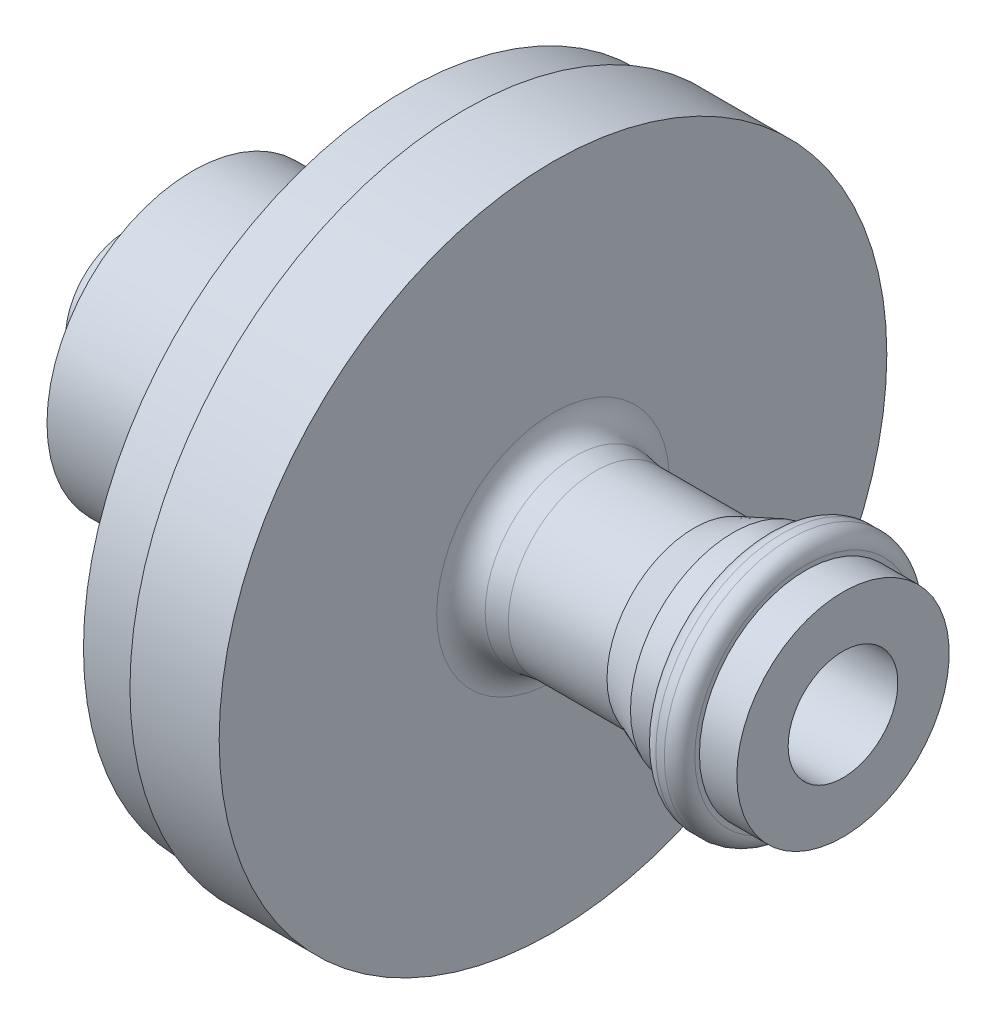
ISO-10303-21;
HEADER;
FILE_DESCRIPTION(('STEP AP214'),'2;1');
FILE_NAME('part.step','',(''),(''),'','','');
FILE_SCHEMA(('AUTOMOTIVE_DESIGN { 1 0 10303 214 1 1 1 1 }'));
ENDSEC;
DATA;
#1=APPLICATION_CONTEXT('core data for automotive mechanical design processes');
#2=APPLICATION_PROTOCOL_DEFINITION('international standard','automotive_design',2000,#1);
#3=PRODUCT_CONTEXT('',#1,'mechanical');
#4=PRODUCT('Part','Part','',(#3));
#5=PRODUCT_RELATED_PRODUCT_CATEGORY('part','',(#4));
#6=PRODUCT_DEFINITION_FORMATION('','',#4);
#7=PRODUCT_DEFINITION_CONTEXT('part definition',#1,'design');
#8=PRODUCT_DEFINITION('design','',#6,#7);
#9=PRODUCT_DEFINITION_SHAPE('','',#8);
#10=(LENGTH_UNIT() NAMED_UNIT(*) SI_UNIT(.MILLI.,.METRE.));
#11=(NAMED_UNIT(*) PLANE_ANGLE_UNIT() SI_UNIT($,.RADIAN.));
#12=(NAMED_UNIT(*) SI_UNIT($,.STERADIAN.) SOLID_ANGLE_UNIT());
#13=UNCERTAINTY_MEASURE_WITH_UNIT(LENGTH_MEASURE(1.E-05),#10,'distance_accuracy_value','');
#14=(GEOMETRIC_REPRESENTATION_CONTEXT(3) GLOBAL_UNCERTAINTY_ASSIGNED_CONTEXT((#13)) GLOBAL_UNIT_ASSIGNED_CONTEXT((#10,
#11,#12)) REPRESENTATION_CONTEXT('',''));
#15=CARTESIAN_POINT('',(0.,0.,0.));
#16=DIRECTION('',(0.,0.,1.));
#17=DIRECTION('',(1.,0.,0.));
#18=AXIS2_PLACEMENT_3D('',#15,#16,#17);
#19=CARTESIAN_POINT('',(10.4137338380613,0.,0.));
#20=DIRECTION('',(1.,0.,0.));
#21=DIRECTION('',(0.,0.,-1.));
#22=AXIS2_PLACEMENT_3D('',#19,#20,#21);
#23=PLANE('',#22);
#24=CARTESIAN_POINT('',(10.4137338380613,0.,0.));
#25=DIRECTION('',(-1.,0.,0.));
#26=DIRECTION('',(0.,0.,1.));
#27=AXIS2_PLACEMENT_3D('',#24,#25,#26);
#28=CIRCLE('',#27,3.47404107604442);
#29=CARTESIAN_POINT('',(10.4137338380613,0.,3.47404107604442));
#30=VERTEX_POINT('',#29);
#31=EDGE_CURVE('E136',#30,#30,#28,.T.);
#32=ORIENTED_EDGE('',*,*,#31,.T.);
#33=EDGE_LOOP('',(#32));
#34=FACE_BOUND('',#33,.T.);
#35=CARTESIAN_POINT('',(10.4137338380613,0.,0.));
#36=DIRECTION('',(-1.,0.,0.));
#37=DIRECTION('',(0.,0.,1.));
#38=AXIS2_PLACEMENT_3D('',#35,#36,#37);
#39=CIRCLE('',#38,3.62448356072604);
#40=CARTESIAN_POINT('',(10.4137338380613,0.,3.62448356072604));
#41=VERTEX_POINT('',#40);
#42=EDGE_CURVE('E10',#41,#41,#39,.T.);
#43=ORIENTED_EDGE('',*,*,#42,.F.);
#44=EDGE_LOOP('',(#43));
#45=FACE_BOUND('',#44,.T.);
#46=ADVANCED_FACE('F33',(#34,#45),#23,.T.);
#47=CARTESIAN_POINT('',(9.91373383806128,0.,0.));
#48=DIRECTION('',(-1.,0.,0.));
#49=DIRECTION('',(0.,0.,1.));
#50=AXIS2_PLACEMENT_3D('',#47,#48,#49);
#51=TOROIDAL_SURFACE('',#50,3.62448356072604,0.5);
#52=CARTESIAN_POINT('',(9.91373383806127,0.,0.));
#53=DIRECTION('',(-1.,0.,0.));
#54=DIRECTION('',(0.,0.,1.));
#55=AXIS2_PLACEMENT_3D('',#52,#53,#54);
#56=CIRCLE('',#55,4.12448356072604);
#57=CARTESIAN_POINT('',(9.91373383806127,0.,4.12448356072604));
#58=VERTEX_POINT('',#57);
#59=EDGE_CURVE('E39',#58,#58,#56,.T.);
#60=ORIENTED_EDGE('',*,*,#59,.F.);
#61=EDGE_LOOP('',(#60));
#62=FACE_BOUND('',#61,.T.);
#63=ORIENTED_EDGE('',*,*,#42,.T.);
#64=EDGE_LOOP('',(#63));
#65=FACE_BOUND('',#64,.T.);
#66=ADVANCED_FACE('F154',(#62,#65),#51,.T.);
#67=CARTESIAN_POINT('',(-11.7644248083742,0.,0.));
#68=DIRECTION('',(-1.,0.,0.));
#69=DIRECTION('',(0.,0.,1.));
#70=AXIS2_PLACEMENT_3D('',#67,#68,#69);
#71=CYLINDRICAL_SURFACE('',#70,4.12448356072604);
#72=CARTESIAN_POINT('',(9.63650464613597,0.,0.));
#73=DIRECTION('',(-1.,0.,0.));
#74=DIRECTION('',(0.,0.,1.));
#75=AXIS2_PLACEMENT_3D('',#72,#73,#74);
#76=CIRCLE('',#75,4.12448356072604);
#77=CARTESIAN_POINT('',(9.63650464613597,0.,4.12448356072604));
#78=VERTEX_POINT('',#77);
#79=EDGE_CURVE('E43',#78,#78,#76,.T.);
#80=ORIENTED_EDGE('',*,*,#79,.F.);
#81=EDGE_LOOP('',(#80));
#82=FACE_BOUND('',#81,.T.);
#83=ORIENTED_EDGE('',*,*,#59,.T.);
#84=EDGE_LOOP('',(#83));
#85=FACE_BOUND('',#84,.T.);
#86=ADVANCED_FACE('F158',(#82,#85),#71,.T.);
#87=CARTESIAN_POINT('',(9.63650464613596,0.,0.));
#88=DIRECTION('',(-1.,0.,0.));
#89=DIRECTION('',(0.,0.,1.));
#90=AXIS2_PLACEMENT_3D('',#87,#88,#89);
#91=TOROIDAL_SURFACE('',#90,3.62448356072604,0.5);
#92=CARTESIAN_POINT('',(9.13650464613596,0.,0.));
#93=DIRECTION('',(-1.,0.,0.));
#94=DIRECTION('',(0.,0.,1.));
#95=AXIS2_PLACEMENT_3D('',#92,#93,#94);
#96=CIRCLE('',#95,3.62448356072604);
#97=CARTESIAN_POINT('',(9.13650464613596,0.,3.62448356072604));
#98=VERTEX_POINT('',#97);
#99=EDGE_CURVE('E47',#98,#98,#96,.T.);
#100=ORIENTED_EDGE('',*,*,#99,.F.);
#101=EDGE_LOOP('',(#100));
#102=FACE_BOUND('',#101,.T.);
#103=ORIENTED_EDGE('',*,*,#79,.T.);
#104=EDGE_LOOP('',(#103));
#105=FACE_BOUND('',#104,.T.);
#106=ADVANCED_FACE('F163',(#102,#105),#91,.T.);
#107=CARTESIAN_POINT('',(9.13650464613596,0.,0.));
#108=DIRECTION('',(-1.,0.,0.));
#109=DIRECTION('',(0.,0.,1.));
#110=AXIS2_PLACEMENT_3D('',#107,#108,#109);
#111=PLANE('',#110);
#112=ORIENTED_EDGE('',*,*,#99,.T.);
#113=EDGE_LOOP('',(#112));
#114=FACE_BOUND('',#113,.T.);
#115=CARTESIAN_POINT('',(9.13650464613596,0.,0.));
#116=DIRECTION('',(-1.,0.,0.));
#117=DIRECTION('',(0.,0.,1.));
#118=AXIS2_PLACEMENT_3D('',#115,#116,#117);
#119=CIRCLE('',#118,3.35678689662546);
#120=CARTESIAN_POINT('',(9.13650464613596,0.,3.35678689662546));
#121=VERTEX_POINT('',#120);
#122=EDGE_CURVE('E52',#121,#121,#119,.T.);
#123=ORIENTED_EDGE('',*,*,#122,.F.);
#124=EDGE_LOOP('',(#123));
#125=FACE_BOUND('',#124,.T.);
#126=ADVANCED_FACE('F169',(#114,#125),#111,.T.);
#127=CARTESIAN_POINT('',(-11.7644248083742,0.,0.));
#128=DIRECTION('',(-1.,0.,0.));
#129=DIRECTION('',(0.,0.,1.));
#130=AXIS2_PLACEMENT_3D('',#127,#128,#129);
#131=CYLINDRICAL_SURFACE('',#130,3.3567868966255);
#132=ORIENTED_EDGE('',*,*,#122,.T.);
#133=EDGE_LOOP('',(#132));
#134=FACE_BOUND('',#133,.T.);
#135=CARTESIAN_POINT('',(8.04102596729724,0.,0.));
#136=DIRECTION('',(-1.,0.,0.));
#137=DIRECTION('',(0.,0.,1.));
#138=AXIS2_PLACEMENT_3D('',#135,#136,#137);
#139=CIRCLE('',#138,3.35678689662553);
#140=CARTESIAN_POINT('',(8.04102596729724,0.,3.35678689662553));
#141=VERTEX_POINT('',#140);
#142=EDGE_CURVE('E55',#141,#141,#139,.T.);
#143=ORIENTED_EDGE('',*,*,#142,.F.);
#144=EDGE_LOOP('',(#143));
#145=FACE_BOUND('',#144,.T.);
#146=ADVANCED_FACE('F173',(#134,#145),#131,.T.);
#147=CARTESIAN_POINT('',(8.04102596729724,0.,0.));
#148=DIRECTION('',(1.,0.,0.));
#149=DIRECTION('',(0.,0.,-1.));
#150=AXIS2_PLACEMENT_3D('',#147,#148,#149);
#151=CONICAL_SURFACE('',#150,3.35678689662553,0.380506377112419);
#152=CARTESIAN_POINT('',(6.76153152712963,0.,0.));
#153=DIRECTION('',(-1.,0.,0.));
#154=DIRECTION('',(0.,0.,1.));
#155=AXIS2_PLACEMENT_3D('',#152,#153,#154);
#156=CIRCLE('',#155,2.84498912055841);
#157=CARTESIAN_POINT('',(6.76153152712963,0.,2.84498912055841));
#158=VERTEX_POINT('',#157);
#159=EDGE_CURVE('E58',#158,#158,#156,.T.);
#160=ORIENTED_EDGE('',*,*,#159,.F.);
#161=EDGE_LOOP('',(#160));
#162=FACE_BOUND('',#161,.T.);
#163=ORIENTED_EDGE('',*,*,#142,.T.);
#164=EDGE_LOOP('',(#163));
#165=FACE_BOUND('',#164,.T.);
#166=ADVANCED_FACE('F177',(#162,#165),#151,.T.);
#167=CARTESIAN_POINT('',(-11.7644248083742,0.,0.));
#168=DIRECTION('',(-1.,0.,0.));
#169=DIRECTION('',(0.,0.,1.));
#170=AXIS2_PLACEMENT_3D('',#167,#168,#169);
#171=CYLINDRICAL_SURFACE('',#170,2.84498912055841);
#172=CARTESIAN_POINT('',(3.53326863193747,0.,0.));
#173=DIRECTION('',(-1.,0.,0.));
#174=DIRECTION('',(0.,0.,1.));
#175=AXIS2_PLACEMENT_3D('',#172,#173,#174);
#176=CIRCLE('',#175,2.84498912055841);
#177=CARTESIAN_POINT('',(3.53326863193747,0.,2.84498912055841));
#178=VERTEX_POINT('',#177);
#179=EDGE_CURVE('E61',#178,#178,#176,.T.);
#180=ORIENTED_EDGE('',*,*,#179,.F.);
#181=EDGE_LOOP('',(#180));
#182=FACE_BOUND('',#181,.T.);
#183=ORIENTED_EDGE('',*,*,#159,.T.);
#184=EDGE_LOOP('',(#183));
#185=FACE_BOUND('',#184,.T.);
#186=ADVANCED_FACE('F181',(#182,#185),#171,.T.);
#187=CARTESIAN_POINT('',(3.53326863193747,0.,0.));
#188=DIRECTION('',(-1.,0.,0.));
#189=DIRECTION('',(0.,0.,1.));
#190=AXIS2_PLACEMENT_3D('',#187,#188,#189);
#191=CONICAL_SURFACE('',#190,2.84498912055841,0.157318630881683);
#192=CARTESIAN_POINT('',(2.88095903547333,0.,0.));
#193=DIRECTION('',(-1.,0.,0.));
#194=DIRECTION('',(0.,0.,1.));
#195=AXIS2_PLACEMENT_3D('',#192,#193,#194);
#196=CIRCLE('',#195,2.94846462865671);
#197=CARTESIAN_POINT('',(2.88095903547333,0.,2.94846462865671));
#198=VERTEX_POINT('',#197);
#199=EDGE_CURVE('E64',#198,#198,#196,.T.);
#200=ORIENTED_EDGE('',*,*,#199,.F.);
#201=EDGE_LOOP('',(#200));
#202=FACE_BOUND('',#201,.T.);
#203=ORIENTED_EDGE('',*,*,#179,.T.);
#204=EDGE_LOOP('',(#203));
#205=FACE_BOUND('',#204,.T.);
#206=ADVANCED_FACE('F185',(#202,#205),#191,.T.);
#207=CARTESIAN_POINT('',(3.01675380098561,0.,0.));
#208=DIRECTION('',(-1.,0.,0.));
#209=DIRECTION('',(0.,0.,1.));
#210=AXIS2_PLACEMENT_3D('',#207,#208,#209);
#211=TOROIDAL_SURFACE('',#210,3.80451482180105,0.866753800985605);
#212=ORIENTED_EDGE('',*,*,#199,.T.);
#213=EDGE_LOOP('',(#212));
#214=FACE_BOUND('',#213,.T.);
#215=CARTESIAN_POINT('',(2.15,0.,0.));
#216=DIRECTION('',(-1.,0.,0.));
#217=DIRECTION('',(0.,0.,1.));
#218=AXIS2_PLACEMENT_3D('',#215,#216,#217);
#219=CIRCLE('',#218,3.80451482180105);
#220=CARTESIAN_POINT('',(2.15,0.,3.80451482180105));
#221=VERTEX_POINT('',#220);
#222=EDGE_CURVE('E67',#221,#221,#219,.T.);
#223=ORIENTED_EDGE('',*,*,#222,.F.);
#224=EDGE_LOOP('',(#223));
#225=FACE_BOUND('',#224,.T.);
#226=ADVANCED_FACE('F189',(#214,#225),#211,.F.);
#227=CARTESIAN_POINT('',(2.15,0.,0.));
#228=DIRECTION('',(1.,0.,0.));
#229=DIRECTION('',(0.,0.,-1.));
#230=AXIS2_PLACEMENT_3D('',#227,#228,#229);
#231=PLANE('',#230);
#232=ORIENTED_EDGE('',*,*,#222,.T.);
#233=EDGE_LOOP('',(#232));
#234=FACE_BOUND('',#233,.T.);
#235=CARTESIAN_POINT('',(2.15,0.,0.));
#236=DIRECTION('',(-1.,0.,0.));
#237=DIRECTION('',(0.,0.,1.));
#238=AXIS2_PLACEMENT_3D('',#235,#236,#237);
#239=CIRCLE('',#238,10.9195203977516);
#240=CARTESIAN_POINT('',(2.15,0.,10.9195203977516));
#241=VERTEX_POINT('',#240);
#242=EDGE_CURVE('E70',#241,#241,#239,.T.);
#243=ORIENTED_EDGE('',*,*,#242,.F.);
#244=EDGE_LOOP('',(#243));
#245=FACE_BOUND('',#244,.T.);
#246=ADVANCED_FACE('F193',(#234,#245),#231,.T.);
#247=CARTESIAN_POINT('',(-11.7644248083742,0.,0.));
#248=DIRECTION('',(-1.,0.,0.));
#249=DIRECTION('',(0.,0.,1.));
#250=AXIS2_PLACEMENT_3D('',#247,#248,#249);
#251=CYLINDRICAL_SURFACE('',#250,10.9195203977516);
#252=CARTESIAN_POINT('',(-0.768316057663421,0.,0.));
#253=DIRECTION('',(-1.,0.,0.));
#254=DIRECTION('',(0.,0.,1.));
#255=AXIS2_PLACEMENT_3D('',#252,#253,#254);
#256=CIRCLE('',#255,10.9195203977516);
#257=CARTESIAN_POINT('',(-0.768316057663421,0.,10.9195203977516));
#258=VERTEX_POINT('',#257);
#259=EDGE_CURVE('E73',#258,#258,#256,.T.);
#260=ORIENTED_EDGE('',*,*,#259,.F.);
#261=EDGE_LOOP('',(#260));
#262=FACE_BOUND('',#261,.T.);
#263=ORIENTED_EDGE('',*,*,#242,.T.);
#264=EDGE_LOOP('',(#263));
#265=FACE_BOUND('',#264,.T.);
#266=ADVANCED_FACE('F197',(#262,#265),#251,.T.);
#267=CARTESIAN_POINT('',(-0.768316057663421,0.,0.));
#268=DIRECTION('',(1.,0.,0.));
#269=DIRECTION('',(0.,0.,-1.));
#270=AXIS2_PLACEMENT_3D('',#267,#268,#269);
#271=PLANE('',#270);
#272=CARTESIAN_POINT('',(-0.768316057663421,0.,0.));
#273=DIRECTION('',(-1.,0.,0.));
#274=DIRECTION('',(0.,0.,1.));
#275=AXIS2_PLACEMENT_3D('',#272,#273,#274);
#276=CIRCLE('',#275,10.5517481499967);
#277=CARTESIAN_POINT('',(-0.768316057663421,0.,10.5517481499967));
#278=VERTEX_POINT('',#277);
#279=EDGE_CURVE('E76',#278,#278,#276,.T.);
#280=ORIENTED_EDGE('',*,*,#279,.F.);
#281=EDGE_LOOP('',(#280));
#282=FACE_BOUND('',#281,.T.);
#283=ORIENTED_EDGE('',*,*,#259,.T.);
#284=EDGE_LOOP('',(#283));
#285=FACE_BOUND('',#284,.T.);
#286=ADVANCED_FACE('F201',(#282,#285),#271,.F.);
#287=CARTESIAN_POINT('',(-11.7644248083742,0.,0.));
#288=DIRECTION('',(-1.,0.,0.));
#289=DIRECTION('',(0.,0.,1.));
#290=AXIS2_PLACEMENT_3D('',#287,#288,#289);
#291=CYLINDRICAL_SURFACE('',#290,10.5517481499967);
#292=CARTESIAN_POINT('',(-2.65709638196131,0.,0.));
#293=DIRECTION('',(-1.,0.,0.));
#294=DIRECTION('',(0.,0.,1.));
#295=AXIS2_PLACEMENT_3D('',#292,#293,#294);
#296=CIRCLE('',#295,10.5517481499967);
#297=CARTESIAN_POINT('',(-2.65709638196131,0.,10.5517481499967));
#298=VERTEX_POINT('',#297);
#299=EDGE_CURVE('E79',#298,#298,#296,.T.);
#300=ORIENTED_EDGE('',*,*,#299,.F.);
#301=EDGE_LOOP('',(#300));
#302=FACE_BOUND('',#301,.T.);
#303=ORIENTED_EDGE('',*,*,#279,.T.);
#304=EDGE_LOOP('',(#303));
#305=FACE_BOUND('',#304,.T.);
#306=ADVANCED_FACE('F205',(#302,#305),#291,.T.);
#307=CARTESIAN_POINT('',(-2.65709638196131,0.,0.));
#308=DIRECTION('',(1.,0.,0.));
#309=DIRECTION('',(0.,0.,-1.));
#310=AXIS2_PLACEMENT_3D('',#307,#308,#309);
#311=PLANE('',#310);
#312=CARTESIAN_POINT('',(-2.65709638196131,0.,0.));
#313=DIRECTION('',(-1.,0.,0.));
#314=DIRECTION('',(0.,0.,1.));
#315=AXIS2_PLACEMENT_3D('',#312,#313,#314);
#316=CIRCLE('',#315,5.79439561695245);
#317=CARTESIAN_POINT('',(-2.65709638196131,0.,5.79439561695245));
#318=VERTEX_POINT('',#317);
#319=EDGE_CURVE('E82',#318,#318,#316,.T.);
#320=ORIENTED_EDGE('',*,*,#319,.F.);
#321=EDGE_LOOP('',(#320));
#322=FACE_BOUND('',#321,.T.);
#323=ORIENTED_EDGE('',*,*,#299,.T.);
#324=EDGE_LOOP('',(#323));
#325=FACE_BOUND('',#324,.T.);
#326=ADVANCED_FACE('F209',(#322,#325),#311,.F.);
#327=CARTESIAN_POINT('',(-3.65709638196131,0.,0.));
#328=DIRECTION('',(-1.,0.,0.));
#329=DIRECTION('',(0.,0.,1.));
#330=AXIS2_PLACEMENT_3D('',#327,#328,#329);
#331=TOROIDAL_SURFACE('',#330,5.79439561695244,0.999999999999997);
#332=ORIENTED_EDGE('',*,*,#319,.T.);
#333=EDGE_LOOP('',(#332));
#334=FACE_BOUND('',#333,.T.);
#335=CARTESIAN_POINT('',(-3.28570570560716,0.,0.));
#336=DIRECTION('',(-1.,0.,0.));
#337=DIRECTION('',(0.,0.,1.));
#338=AXIS2_PLACEMENT_3D('',#335,#336,#337);
#339=CIRCLE('',#338,4.86591892606721);
#340=CARTESIAN_POINT('',(-3.28570570560716,0.,4.86591892606721));
#341=VERTEX_POINT('',#340);
#342=EDGE_CURVE('E85',#341,#341,#339,.T.);
#343=ORIENTED_EDGE('',*,*,#342,.F.);
#344=EDGE_LOOP('',(#343));
#345=FACE_BOUND('',#344,.T.);
#346=ADVANCED_FACE('F213',(#334,#345),#331,.F.);
#347=CARTESIAN_POINT('',(-3.28570570560716,0.,0.));
#348=DIRECTION('',(1.,0.,0.));
#349=DIRECTION('',(0.,0.,-1.));
#350=AXIS2_PLACEMENT_3D('',#347,#348,#349);
#351=CONICAL_SURFACE('',#350,4.86591892606721,0.380506377112419);
#352=CARTESIAN_POINT('',(-3.36097582878731,0.,0.));
#353=DIRECTION('',(-1.,0.,0.));
#354=DIRECTION('',(0.,0.,1.));
#355=AXIS2_PLACEMENT_3D('',#352,#353,#354);
#356=CIRCLE('',#355,4.83581087679515);
#357=CARTESIAN_POINT('',(-3.36097582878731,0.,4.83581087679515));
#358=VERTEX_POINT('',#357);
#359=EDGE_CURVE('E88',#358,#358,#356,.T.);
#360=ORIENTED_EDGE('',*,*,#359,.F.);
#361=EDGE_LOOP('',(#360));
#362=FACE_BOUND('',#361,.T.);
#363=ORIENTED_EDGE('',*,*,#342,.T.);
#364=EDGE_LOOP('',(#363));
#365=FACE_BOUND('',#364,.T.);
#366=ADVANCED_FACE('F217',(#362,#365),#351,.T.);
#367=CARTESIAN_POINT('',(-3.73236650514146,0.,0.));
#368=DIRECTION('',(-1.,0.,0.));
#369=DIRECTION('',(0.,0.,1.));
#370=AXIS2_PLACEMENT_3D('',#367,#368,#369);
#371=TOROIDAL_SURFACE('',#370,5.76428756768038,1.);
#372=ORIENTED_EDGE('',*,*,#359,.T.);
#373=EDGE_LOOP('',(#372));
#374=FACE_BOUND('',#373,.T.);
#375=CARTESIAN_POINT('',(-3.73236650514146,0.,0.));
#376=DIRECTION('',(-1.,0.,0.));
#377=DIRECTION('',(0.,0.,1.));
#378=AXIS2_PLACEMENT_3D('',#375,#376,#377);
#379=CIRCLE('',#378,4.76428756768038);
#380=CARTESIAN_POINT('',(-3.73236650514146,0.,4.76428756768038));
#381=VERTEX_POINT('',#380);
#382=EDGE_CURVE('E91',#381,#381,#379,.T.);
#383=ORIENTED_EDGE('',*,*,#382,.F.);
#384=EDGE_LOOP('',(#383));
#385=FACE_BOUND('',#384,.T.);
#386=ADVANCED_FACE('F221',(#374,#385),#371,.F.);
#387=CARTESIAN_POINT('',(-11.7644248083742,0.,0.));
#388=DIRECTION('',(-1.,0.,0.));
#389=DIRECTION('',(0.,0.,1.));
#390=AXIS2_PLACEMENT_3D('',#387,#388,#389);
#391=CYLINDRICAL_SURFACE('',#390,4.76428756768038);
#392=CARTESIAN_POINT('',(-9.63684752807549,0.,0.));
#393=DIRECTION('',(-1.,0.,0.));
#394=DIRECTION('',(0.,0.,1.));
#395=AXIS2_PLACEMENT_3D('',#392,#393,#394);
#396=CIRCLE('',#395,4.76428756768038);
#397=CARTESIAN_POINT('',(-9.63684752807549,0.,4.76428756768038));
#398=VERTEX_POINT('',#397);
#399=EDGE_CURVE('E94',#398,#398,#396,.T.);
#400=ORIENTED_EDGE('',*,*,#399,.F.);
#401=EDGE_LOOP('',(#400));
#402=FACE_BOUND('',#401,.T.);
#403=ORIENTED_EDGE('',*,*,#382,.T.);
#404=EDGE_LOOP('',(#403));
#405=FACE_BOUND('',#404,.T.);
#406=ADVANCED_FACE('F225',(#402,#405),#391,.T.);
#407=CARTESIAN_POINT('',(-9.63684752807549,0.,0.));
#408=DIRECTION('',(1.,0.,0.));
#409=DIRECTION('',(0.,0.,-1.));
#410=AXIS2_PLACEMENT_3D('',#407,#408,#409);
#411=PLANE('',#410);
#412=CARTESIAN_POINT('',(-9.63684752807549,0.,0.));
#413=DIRECTION('',(-1.,0.,0.));
#414=DIRECTION('',(0.,0.,1.));
#415=AXIS2_PLACEMENT_3D('',#412,#413,#414);
#416=CIRCLE('',#415,3.96858436652777);
#417=CARTESIAN_POINT('',(-9.63684752807549,0.,3.96858436652777));
#418=VERTEX_POINT('',#417);
#419=EDGE_CURVE('E97',#418,#418,#416,.T.);
#420=ORIENTED_EDGE('',*,*,#419,.F.);
#421=EDGE_LOOP('',(#420));
#422=FACE_BOUND('',#421,.T.);
#423=ORIENTED_EDGE('',*,*,#399,.T.);
#424=EDGE_LOOP('',(#423));
#425=FACE_BOUND('',#424,.T.);
#426=ADVANCED_FACE('F229',(#422,#425),#411,.F.);
#427=CARTESIAN_POINT('',(-11.7644248083742,0.,0.));
#428=DIRECTION('',(-1.,0.,0.));
#429=DIRECTION('',(0.,0.,1.));
#430=AXIS2_PLACEMENT_3D('',#427,#428,#429);
#431=CYLINDRICAL_SURFACE('',#430,3.96858436652777);
#432=CARTESIAN_POINT('',(-4.45631601139914,0.,0.));
#433=DIRECTION('',(-1.,0.,0.));
#434=DIRECTION('',(0.,0.,1.));
#435=AXIS2_PLACEMENT_3D('',#432,#433,#434);
#436=CIRCLE('',#435,3.96858436652777);
#437=CARTESIAN_POINT('',(-4.45631601139914,0.,3.96858436652777));
#438=VERTEX_POINT('',#437);
#439=EDGE_CURVE('E100',#438,#438,#436,.T.);
#440=ORIENTED_EDGE('',*,*,#439,.F.);
#441=EDGE_LOOP('',(#440));
#442=FACE_BOUND('',#441,.T.);
#443=ORIENTED_EDGE('',*,*,#419,.T.);
#444=EDGE_LOOP('',(#443));
#445=FACE_BOUND('',#444,.T.);
#446=ADVANCED_FACE('F233',(#442,#445),#431,.F.);
#447=CARTESIAN_POINT('',(-4.45631601139914,0.,0.));
#448=DIRECTION('',(-1.,0.,0.));
#449=DIRECTION('',(0.,0.,1.));
#450=AXIS2_PLACEMENT_3D('',#447,#448,#449);
#451=TOROIDAL_SURFACE('',#450,2.96858436652777,1.);
#452=ORIENTED_EDGE('',*,*,#439,.T.);
#453=EDGE_LOOP('',(#452));
#454=FACE_BOUND('',#453,.T.);
#455=CARTESIAN_POINT('',(-3.45676955530983,0.,0.));
#456=DIRECTION('',(-1.,0.,0.));
#457=DIRECTION('',(0.,0.,1.));
#458=AXIS2_PLACEMENT_3D('',#455,#456,#457);
#459=CIRCLE('',#458,2.99869885007485);
#460=CARTESIAN_POINT('',(-3.45676955530983,0.,2.99869885007485));
#461=VERTEX_POINT('',#460);
#462=EDGE_CURVE('E103',#461,#461,#459,.T.);
#463=ORIENTED_EDGE('',*,*,#462,.F.);
#464=EDGE_LOOP('',(#463));
#465=FACE_BOUND('',#464,.T.);
#466=ADVANCED_FACE('F237',(#454,#465),#451,.F.);
#467=CARTESIAN_POINT('',(-4.45631601139914,0.,0.));
#468=DIRECTION('',(-1.,0.,0.));
#469=DIRECTION('',(0.,0.,1.));
#470=AXIS2_PLACEMENT_3D('',#467,#468,#469);
#471=TOROIDAL_SURFACE('',#470,3.02881333362192,1.);
#472=CARTESIAN_POINT('',(-4.45631601139914,0.,0.));
#473=DIRECTION('',(-1.,0.,0.));
#474=DIRECTION('',(0.,0.,1.));
#475=AXIS2_PLACEMENT_3D('',#472,#473,#474);
#476=CIRCLE('',#475,2.02881333362192);
#477=CARTESIAN_POINT('',(-4.45631601139914,0.,2.02881333362192));
#478=VERTEX_POINT('',#477);
#479=EDGE_CURVE('E106',#478,#478,#476,.T.);
#480=ORIENTED_EDGE('',*,*,#479,.F.);
#481=EDGE_LOOP('',(#480));
#482=FACE_BOUND('',#481,.T.);
#483=ORIENTED_EDGE('',*,*,#462,.T.);
#484=EDGE_LOOP('',(#483));
#485=FACE_BOUND('',#484,.T.);
#486=ADVANCED_FACE('F241',(#482,#485),#471,.F.);
#487=CARTESIAN_POINT('',(-11.7644248083742,0.,0.));
#488=DIRECTION('',(-1.,0.,0.));
#489=DIRECTION('',(0.,0.,1.));
#490=AXIS2_PLACEMENT_3D('',#487,#488,#489);
#491=CYLINDRICAL_SURFACE('',#490,2.02881333362192);
#492=CARTESIAN_POINT('',(-11.7644248083742,0.,0.));
#493=DIRECTION('',(-1.,0.,0.));
#494=DIRECTION('',(0.,0.,1.));
#495=AXIS2_PLACEMENT_3D('',#492,#493,#494);
#496=CIRCLE('',#495,2.02881333362192);
#497=CARTESIAN_POINT('',(-11.7644248083742,0.,2.02881333362192));
#498=VERTEX_POINT('',#497);
#499=EDGE_CURVE('E109',#498,#498,#496,.T.);
#500=ORIENTED_EDGE('',*,*,#499,.F.);
#501=EDGE_LOOP('',(#500));
#502=FACE_BOUND('',#501,.T.);
#503=ORIENTED_EDGE('',*,*,#479,.T.);
#504=EDGE_LOOP('',(#503));
#505=FACE_BOUND('',#504,.T.);
#506=ADVANCED_FACE('F245',(#502,#505),#491,.T.);
#507=CARTESIAN_POINT('',(-11.7644248083742,0.,0.));
#508=DIRECTION('',(1.,0.,0.));
#509=DIRECTION('',(0.,0.,-1.));
#510=AXIS2_PLACEMENT_3D('',#507,#508,#509);
#511=PLANE('',#510);
#512=CARTESIAN_POINT('',(-11.7644248083742,0.,0.));
#513=DIRECTION('',(-1.,0.,0.));
#514=DIRECTION('',(0.,0.,1.));
#515=AXIS2_PLACEMENT_3D('',#512,#513,#514);
#516=CIRCLE('',#515,1.40400938378666);
#517=CARTESIAN_POINT('',(-11.7644248083742,0.,1.40400938378666));
#518=VERTEX_POINT('',#517);
#519=EDGE_CURVE('E112',#518,#518,#516,.T.);
#520=ORIENTED_EDGE('',*,*,#519,.F.);
#521=EDGE_LOOP('',(#520));
#522=FACE_BOUND('',#521,.T.);
#523=ORIENTED_EDGE('',*,*,#499,.T.);
#524=EDGE_LOOP('',(#523));
#525=FACE_BOUND('',#524,.T.);
#526=ADVANCED_FACE('F249',(#522,#525),#511,.F.);
#527=CARTESIAN_POINT('',(-11.7644248083742,0.,0.));
#528=DIRECTION('',(-1.,0.,0.));
#529=DIRECTION('',(0.,0.,1.));
#530=AXIS2_PLACEMENT_3D('',#527,#528,#529);
#531=CYLINDRICAL_SURFACE('',#530,1.40400938378666);
#532=CARTESIAN_POINT('',(-4.567593558812,0.,0.));
#533=DIRECTION('',(-1.,0.,0.));
#534=DIRECTION('',(0.,0.,1.));
#535=AXIS2_PLACEMENT_3D('',#532,#533,#534);
#536=CIRCLE('',#535,1.40400938378666);
#537=CARTESIAN_POINT('',(-4.567593558812,0.,1.40400938378666));
#538=VERTEX_POINT('',#537);
#539=EDGE_CURVE('E115',#538,#538,#536,.T.);
#540=ORIENTED_EDGE('',*,*,#539,.F.);
#541=EDGE_LOOP('',(#540));
#542=FACE_BOUND('',#541,.T.);
#543=ORIENTED_EDGE('',*,*,#519,.T.);
#544=EDGE_LOOP('',(#543));
#545=FACE_BOUND('',#544,.T.);
#546=ADVANCED_FACE('F253',(#542,#545),#531,.F.);
#547=CARTESIAN_POINT('',(-4.567593558812,0.,0.));
#548=DIRECTION('',(-1.,0.,0.));
#549=DIRECTION('',(0.,0.,1.));
#550=AXIS2_PLACEMENT_3D('',#547,#548,#549);
#551=DEGENERATE_TOROIDAL_SURFACE('',#550,0.404009383786662,0.999999833393173,.T.);
#552=ORIENTED_EDGE('',*,*,#539,.T.);
#553=EDGE_LOOP('',(#552));
#554=FACE_BOUND('',#553,.T.);
#555=CARTESIAN_POINT('',(-3.5675942252392,0.,0.));
#556=DIRECTION('',(-1.,0.,0.));
#557=DIRECTION('',(0.,0.,1.));
#558=AXIS2_PLACEMENT_3D('',#555,#556,#557);
#559=CIRCLE('',#558,0.403193034135122);
#560=CARTESIAN_POINT('',(-3.5675942252392,0.,0.403193034135122));
#561=VERTEX_POINT('',#560);
#562=EDGE_CURVE('E118',#561,#561,#559,.T.);
#563=ORIENTED_EDGE('',*,*,#562,.F.);
#564=EDGE_LOOP('',(#563));
#565=FACE_BOUND('',#564,.T.);
#566=ADVANCED_FACE('F257',(#554,#565),#551,.F.);
#567=CARTESIAN_POINT('',(-3.5675942252392,0.,0.));
#568=DIRECTION('',(-1.,0.,0.));
#569=DIRECTION('',(0.,0.,1.));
#570=AXIS2_PLACEMENT_3D('',#567,#568,#569);
#571=CONICAL_SURFACE('',#570,0.403193034135122,0.000816350014231878);
#572=CARTESIAN_POINT('',(4.041203220594,0.,0.));
#573=DIRECTION('',(-1.,0.,0.));
#574=DIRECTION('',(0.,0.,1.));
#575=AXIS2_PLACEMENT_3D('',#572,#573,#574);
#576=CIRCLE('',#575,0.396981590852103);
#577=CARTESIAN_POINT('',(4.041203220594,0.,0.396981590852103));
#578=VERTEX_POINT('',#577);
#579=EDGE_CURVE('E121',#578,#578,#576,.T.);
#580=ORIENTED_EDGE('',*,*,#579,.F.);
#581=EDGE_LOOP('',(#580));
#582=FACE_BOUND('',#581,.T.);
#583=ORIENTED_EDGE('',*,*,#562,.T.);
#584=EDGE_LOOP('',(#583));
#585=FACE_BOUND('',#584,.T.);
#586=ADVANCED_FACE('F261',(#582,#585),#571,.F.);
#587=CARTESIAN_POINT('',(4.041203220594,0.,0.));
#588=DIRECTION('',(-1.,0.,0.));
#589=DIRECTION('',(0.,0.,1.));
#590=AXIS2_PLACEMENT_3D('',#587,#588,#589);
#591=PLANE('',#590);
#592=CARTESIAN_POINT('',(4.041203220594,0.,0.));
#593=DIRECTION('',(-1.,0.,0.));
#594=DIRECTION('',(0.,0.,1.));
#595=AXIS2_PLACEMENT_3D('',#592,#593,#594);
#596=CIRCLE('',#595,0.793963181704206);
#597=CARTESIAN_POINT('',(4.041203220594,0.,0.793963181704206));
#598=VERTEX_POINT('',#597);
#599=EDGE_CURVE('E124',#598,#598,#596,.T.);
#600=ORIENTED_EDGE('',*,*,#599,.F.);
#601=EDGE_LOOP('',(#600));
#602=FACE_BOUND('',#601,.T.);
#603=ORIENTED_EDGE('',*,*,#579,.T.);
#604=EDGE_LOOP('',(#603));
#605=FACE_BOUND('',#604,.T.);
#606=ADVANCED_FACE('F265',(#602,#605),#591,.F.);
#607=CARTESIAN_POINT('',(5.041203220594,0.,0.));
#608=DIRECTION('',(-1.,0.,0.));
#609=DIRECTION('',(0.,0.,1.));
#610=AXIS2_PLACEMENT_3D('',#607,#608,#609);
#611=DEGENERATE_TOROIDAL_SURFACE('',#610,0.793963181704206,1.,.T.);
#612=CARTESIAN_POINT('',(5.041203220594,0.,0.));
#613=DIRECTION('',(-1.,0.,0.));
#614=DIRECTION('',(0.,0.,1.));
#615=AXIS2_PLACEMENT_3D('',#612,#613,#614);
#616=CIRCLE('',#615,1.79396318170421);
#617=CARTESIAN_POINT('',(5.041203220594,0.,1.79396318170421));
#618=VERTEX_POINT('',#617);
#619=EDGE_CURVE('E127',#618,#618,#616,.T.);
#620=ORIENTED_EDGE('',*,*,#619,.F.);
#621=EDGE_LOOP('',(#620));
#622=FACE_BOUND('',#621,.T.);
#623=ORIENTED_EDGE('',*,*,#599,.T.);
#624=EDGE_LOOP('',(#623));
#625=FACE_BOUND('',#624,.T.);
#626=ADVANCED_FACE('F269',(#622,#625),#611,.F.);
#627=CARTESIAN_POINT('',(-11.7644248083742,0.,0.));
#628=DIRECTION('',(-1.,0.,0.));
#629=DIRECTION('',(0.,0.,1.));
#630=AXIS2_PLACEMENT_3D('',#627,#628,#629);
#631=CYLINDRICAL_SURFACE('',#630,1.79396318170421);
#632=CARTESIAN_POINT('',(11.6360952713811,0.,0.));
#633=DIRECTION('',(-1.,0.,0.));
#634=DIRECTION('',(0.,0.,1.));
#635=AXIS2_PLACEMENT_3D('',#632,#633,#634);
#636=CIRCLE('',#635,1.79396318170421);
#637=CARTESIAN_POINT('',(11.6360952713811,0.,1.79396318170421));
#638=VERTEX_POINT('',#637);
#639=EDGE_CURVE('E130',#638,#638,#636,.T.);
#640=ORIENTED_EDGE('',*,*,#639,.F.);
#641=EDGE_LOOP('',(#640));
#642=FACE_BOUND('',#641,.T.);
#643=ORIENTED_EDGE('',*,*,#619,.T.);
#644=EDGE_LOOP('',(#643));
#645=FACE_BOUND('',#644,.T.);
#646=ADVANCED_FACE('F150',(#642,#645),#631,.F.);
#647=CARTESIAN_POINT('',(11.6360952713811,0.,0.));
#648=DIRECTION('',(-1.,0.,0.));
#649=DIRECTION('',(0.,0.,1.));
#650=AXIS2_PLACEMENT_3D('',#647,#648,#649);
#651=PLANE('',#650);
#652=CARTESIAN_POINT('',(11.6360952713811,0.,0.));
#653=DIRECTION('',(-1.,0.,0.));
#654=DIRECTION('',(0.,0.,1.));
#655=AXIS2_PLACEMENT_3D('',#652,#653,#654);
#656=CIRCLE('',#655,3.47404107604442);
#657=CARTESIAN_POINT('',(11.6360952713811,0.,3.47404107604442));
#658=VERTEX_POINT('',#657);
#659=EDGE_CURVE('E133',#658,#658,#656,.T.);
#660=ORIENTED_EDGE('',*,*,#659,.F.);
#661=EDGE_LOOP('',(#660));
#662=FACE_BOUND('',#661,.T.);
#663=ORIENTED_EDGE('',*,*,#639,.T.);
#664=EDGE_LOOP('',(#663));
#665=FACE_BOUND('',#664,.T.);
#666=ADVANCED_FACE('F144',(#662,#665),#651,.F.);
#667=CARTESIAN_POINT('',(-11.7644248083742,0.,0.));
#668=DIRECTION('',(-1.,0.,0.));
#669=DIRECTION('',(0.,0.,1.));
#670=AXIS2_PLACEMENT_3D('',#667,#668,#669);
#671=CYLINDRICAL_SURFACE('',#670,3.47404107604442);
#672=ORIENTED_EDGE('',*,*,#659,.T.);
#673=EDGE_LOOP('',(#672));
#674=FACE_BOUND('',#673,.T.);
#675=ORIENTED_EDGE('',*,*,#31,.F.);
#676=EDGE_LOOP('',(#675));
#677=FACE_BOUND('',#676,.T.);
#678=ADVANCED_FACE('F142',(#674,#677),#671,.T.);
#679=CLOSED_SHELL('',(#46,#66,#86,#106,#126,#146,#166,#186,#206,#226,#246,#266,#286,#306,#326,
#346,#366,#386,#406,#426,#446,#466,#486,#506,#526,#546,#566,#586,#606,#626,#646,#666,#678));
#680=MANIFOLD_SOLID_BREP('B2',#679);
#681=ADVANCED_BREP_SHAPE_REPRESENTATION('',(#18,#680),#14);
#682=SHAPE_DEFINITION_REPRESENTATION(#9,#681);
ENDSEC;
END-ISO-10303-21;
